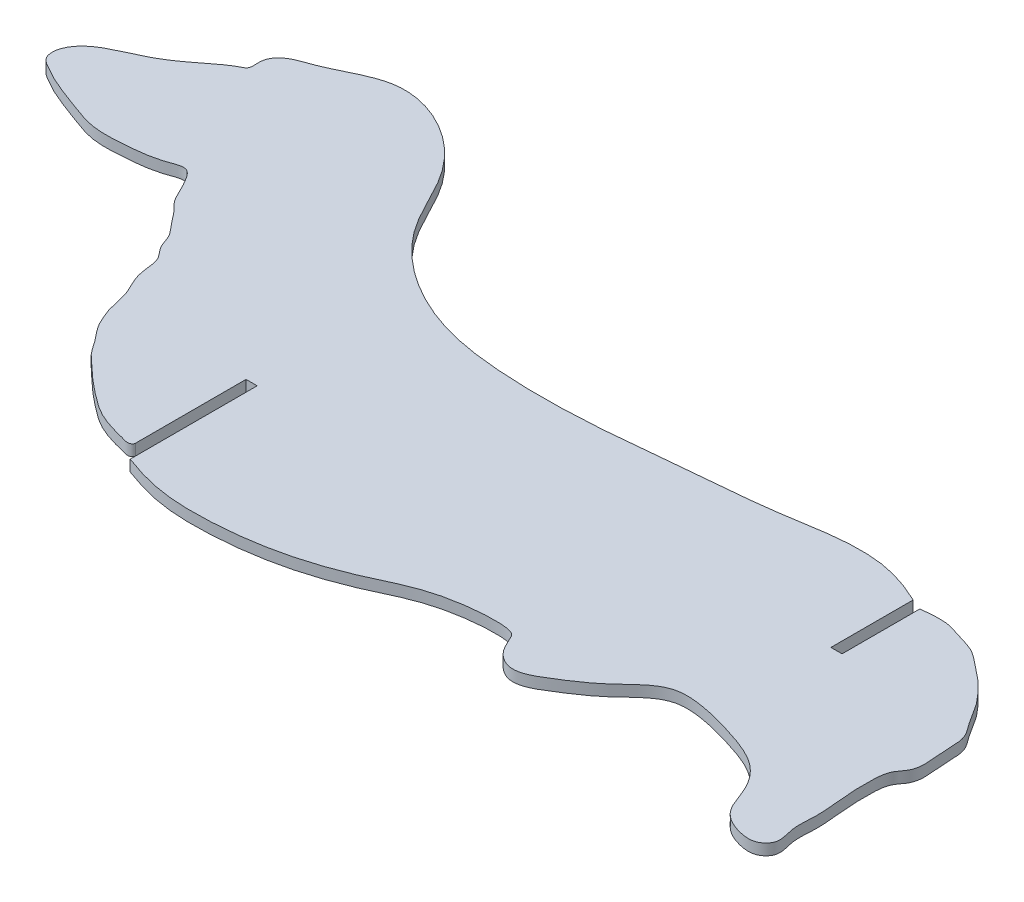
ISO-10303-21;
HEADER;
FILE_DESCRIPTION(('STEP AP214'),'2;1');
FILE_NAME('part.step','',(''),(''),'','','');
FILE_SCHEMA(('AUTOMOTIVE_DESIGN { 1 0 10303 214 1 1 1 1 }'));
ENDSEC;
DATA;
#1=APPLICATION_CONTEXT('core data for automotive mechanical design processes');
#2=APPLICATION_PROTOCOL_DEFINITION('international standard','automotive_design',2000,#1);
#3=PRODUCT_CONTEXT('',#1,'mechanical');
#4=PRODUCT('Part','Part','',(#3));
#5=PRODUCT_RELATED_PRODUCT_CATEGORY('part','',(#4));
#6=PRODUCT_DEFINITION_FORMATION('','',#4);
#7=PRODUCT_DEFINITION_CONTEXT('part definition',#1,'design');
#8=PRODUCT_DEFINITION('design','',#6,#7);
#9=PRODUCT_DEFINITION_SHAPE('','',#8);
#10=(LENGTH_UNIT() NAMED_UNIT(*) SI_UNIT(.MILLI.,.METRE.));
#11=(NAMED_UNIT(*) PLANE_ANGLE_UNIT() SI_UNIT($,.RADIAN.));
#12=(NAMED_UNIT(*) SI_UNIT($,.STERADIAN.) SOLID_ANGLE_UNIT());
#13=UNCERTAINTY_MEASURE_WITH_UNIT(LENGTH_MEASURE(1.E-05),#10,'distance_accuracy_value','');
#14=(GEOMETRIC_REPRESENTATION_CONTEXT(3) GLOBAL_UNCERTAINTY_ASSIGNED_CONTEXT((#13)) GLOBAL_UNIT_ASSIGNED_CONTEXT((#10,
#11,#12)) REPRESENTATION_CONTEXT('',''));
#15=CARTESIAN_POINT('',(0.,0.,0.));
#16=DIRECTION('',(0.,0.,1.));
#17=DIRECTION('',(1.,0.,0.));
#18=AXIS2_PLACEMENT_3D('',#15,#16,#17);
#19=CARTESIAN_POINT('',(347.154940736073,4.,-178.835013287636));
#20=CARTESIAN_POINT('',(342.293607839143,4.,-181.186392839244));
#21=CARTESIAN_POINT('',(331.73242464091,4.,-185.153225370964));
#22=CARTESIAN_POINT('',(314.956061353341,4.,-185.038996912233));
#23=CARTESIAN_POINT('',(301.512037992343,4.,-182.548513603452));
#24=CARTESIAN_POINT('',(288.369314790779,4.,-180.712531749732));
#25=CARTESIAN_POINT('',(275.639773261778,4.,-179.518770363029));
#26=CARTESIAN_POINT('',(261.9069176465,4.,-178.33166597074));
#27=CARTESIAN_POINT('',(236.902942328031,4.,-175.607244471271));
#28=CARTESIAN_POINT('',(210.119280857842,4.,-174.2129973985));
#29=CARTESIAN_POINT('',(171.594159560606,4.,-179.382417069147));
#30=CARTESIAN_POINT('',(143.24394217816,4.,-196.951507972517));
#31=CARTESIAN_POINT('',(132.124684399036,4.,-225.946741459528));
#32=CARTESIAN_POINT('',(116.595629551791,4.,-241.881053305595));
#33=CARTESIAN_POINT('',(93.2745023401633,4.,-249.601998196712));
#34=CARTESIAN_POINT('',(77.8881854564013,4.,-238.714659758299));
#35=CARTESIAN_POINT('',(65.9007764332672,4.,-235.410172879554));
#36=CARTESIAN_POINT('',(61.575621974339,4.,-230.200420009082));
#37=CARTESIAN_POINT('',(63.1087336538009,4.,-225.045424662309));
#38=CARTESIAN_POINT('',(58.2569010594505,4.,-222.644574465773));
#39=CARTESIAN_POINT('',(51.9612501600106,4.,-217.76519650174));
#40=CARTESIAN_POINT('',(40.1028496615363,4.,-208.402991105785));
#41=CARTESIAN_POINT('',(25.0000577471441,4.,-204.584232406003));
#42=CARTESIAN_POINT('',(21.9847867933513,4.,-195.272937398553));
#43=CARTESIAN_POINT('',(22.3434038090854,4.,-191.414002466728));
#44=CARTESIAN_POINT('',(26.5729575530105,4.,-188.934116633953));
#45=CARTESIAN_POINT('',(32.4195465597208,4.,-185.632752641192));
#46=CARTESIAN_POINT('',(41.394029651552,4.,-182.58042096067));
#47=CARTESIAN_POINT('',(52.2541674024652,4.,-177.924905927661));
#48=CARTESIAN_POINT('',(64.955899896082,4.,-178.924815079892));
#49=CARTESIAN_POINT('',(74.5177939393612,4.,-179.764064840546));
#50=CARTESIAN_POINT('',(82.7519774367339,4.,-183.513799817442));
#51=CARTESIAN_POINT('',(85.9496901633869,4.,-178.772495524308));
#52=CARTESIAN_POINT('',(88.1852768478482,4.,-174.730099673028));
#53=CARTESIAN_POINT('',(90.0906806723707,4.,-170.107982483323));
#54=CARTESIAN_POINT('',(94.2337058814481,4.,-166.565028145157));
#55=CARTESIAN_POINT('',(96.9706817129451,4.,-162.305172448172));
#56=CARTESIAN_POINT('',(100.834329657309,4.,-158.438030066546));
#57=CARTESIAN_POINT('',(101.758335513837,4.,-153.260977062174));
#58=CARTESIAN_POINT('',(106.234933482954,4.,-149.362890402545));
#59=CARTESIAN_POINT('',(106.221292919551,4.,-143.311246980581));
#60=CARTESIAN_POINT('',(107.917669571942,4.,-137.852932470716));
#61=CARTESIAN_POINT('',(111.115416691115,4.,-132.255595862831));
#62=CARTESIAN_POINT('',(111.717279817789,4.,-126.531053277943));
#63=CARTESIAN_POINT('',(113.762529451718,4.,-121.417745578651));
#64=CARTESIAN_POINT('',(115.78796773556,4.,-116.925498417731));
#65=CARTESIAN_POINT('',(119.696113679794,4.,-112.776543781616));
#66=CARTESIAN_POINT('',(122.55939647023,4.,-107.879756860782));
#67=CARTESIAN_POINT('',(126.811902979161,4.,-104.312348214879));
#68=CARTESIAN_POINT('',(131.204516654553,4.,-99.9841873882411));
#69=CARTESIAN_POINT('',(137.851723764725,4.,-94.760355766804));
#70=CARTESIAN_POINT('',(144.639485049006,4.,-89.6770931387765));
#71=CARTESIAN_POINT('',(154.332393864862,4.,-87.3302270861626));
#72=CARTESIAN_POINT('',(154.676156100739,4.,-87.2833505087554));
#73=CARTESIAN_POINT('',(158.493043825809,4.,-85.9402831956329));
#74=CARTESIAN_POINT('',(158.799844598838,4.,-87.8720571740243));
#75=CARTESIAN_POINT('',(158.758898458695,4.,-87.8711346052723));
#76=B_SPLINE_CURVE_WITH_KNOTS('',3,(#19,#20,#21,#22,#23,#24,#25,#26,#27,#28,#29,#30,#31,#32,#33,
#34,#35,#36,#37,#38,#39,#40,#41,#42,#43,#44,#45,#46,#47,#48,#49,#50,#51,#52,#53,#54,#55,#56,#57,
#58,#59,#60,#61,#62,#63,#64,#65,#66,#67,#68,#69,#70,#71,#72,#73,#74,#75),.UNSPECIFIED.,.F.,.F.,
(4,1,1,1,1,1,1,1,1,1,1,1,1,1,1,1,1,1,1,1,1,1,1,1,1,1,1,1,1,1,1,1,1,1,1,1,1,1,1,1,1,1,1,1,1,1,1,
1,1,1,1,1,1,1,4),(0.,0.0278709083375577,0.0570504920506225,0.0848805502092884,
0.0982822597147534,0.125273316528022,0.150633205488108,0.169161561101356,0.25471975074705,
0.287216713923006,0.369493076448606,0.408005119177393,0.444216093894111,0.481764451160458,
0.521976580411592,0.53442600736581,0.54522141725226,0.553498076345198,0.555204353328569,
0.571842805637894,0.594976771085898,0.634375329420594,0.637983125004558,0.644971727318556,
0.652095714653422,0.66152778019762,0.680136978877294,0.700472890115877,0.721552302912233,
0.74331714210923,0.753145997251442,0.760746767574497,0.768608090998904,0.778040156543103,
0.785618969900207,0.796196845838206,0.804076920738509,0.813061588487777,0.82197955399495,
0.832551783881873,0.842282958536683,0.851406113730894,0.865319094380145,0.871224097064775,
0.879723851152031,0.890432724487636,0.900259329538096,0.908606328415212,0.918705106313164,
0.932164237587582,0.951132917555511,0.966810126784208,0.969283816647089,0.975869816184325,1.),.UNSPECIFIED.);
#77=DIRECTION('',(0.,-1.,0.));
#78=VECTOR('',#77,1.);
#79=SURFACE_OF_LINEAR_EXTRUSION('',#76,#78);
#80=CARTESIAN_POINT('',(347.154940736073,0.,-178.835013287636));
#81=CARTESIAN_POINT('',(342.293607839143,0.,-181.186392839244));
#82=CARTESIAN_POINT('',(331.73242464091,0.,-185.153225370964));
#83=CARTESIAN_POINT('',(314.956061353341,0.,-185.038996912233));
#84=CARTESIAN_POINT('',(301.512037992343,0.,-182.548513603452));
#85=CARTESIAN_POINT('',(288.369314790779,0.,-180.712531749732));
#86=CARTESIAN_POINT('',(275.639773261778,0.,-179.518770363029));
#87=CARTESIAN_POINT('',(261.9069176465,0.,-178.33166597074));
#88=CARTESIAN_POINT('',(236.902942328031,0.,-175.607244471271));
#89=CARTESIAN_POINT('',(210.119280857842,0.,-174.2129973985));
#90=CARTESIAN_POINT('',(171.594159560606,0.,-179.382417069147));
#91=CARTESIAN_POINT('',(143.24394217816,0.,-196.951507972517));
#92=CARTESIAN_POINT('',(132.124684399036,0.,-225.946741459528));
#93=CARTESIAN_POINT('',(116.595629551791,0.,-241.881053305595));
#94=CARTESIAN_POINT('',(93.2745023401633,0.,-249.601998196712));
#95=CARTESIAN_POINT('',(77.8881854564013,0.,-238.714659758299));
#96=CARTESIAN_POINT('',(65.9007764332672,0.,-235.410172879554));
#97=CARTESIAN_POINT('',(61.575621974339,0.,-230.200420009082));
#98=CARTESIAN_POINT('',(63.1087336538009,0.,-225.045424662309));
#99=CARTESIAN_POINT('',(58.2569010594505,0.,-222.644574465773));
#100=CARTESIAN_POINT('',(51.9612501600106,0.,-217.76519650174));
#101=CARTESIAN_POINT('',(40.1028496615363,0.,-208.402991105785));
#102=CARTESIAN_POINT('',(25.0000577471441,0.,-204.584232406003));
#103=CARTESIAN_POINT('',(21.9847867933513,0.,-195.272937398553));
#104=CARTESIAN_POINT('',(22.3434038090854,0.,-191.414002466728));
#105=CARTESIAN_POINT('',(26.5729575530105,0.,-188.934116633953));
#106=CARTESIAN_POINT('',(32.4195465597208,0.,-185.632752641192));
#107=CARTESIAN_POINT('',(41.394029651552,0.,-182.58042096067));
#108=CARTESIAN_POINT('',(52.2541674024652,0.,-177.924905927661));
#109=CARTESIAN_POINT('',(64.955899896082,0.,-178.924815079892));
#110=CARTESIAN_POINT('',(74.5177939393612,0.,-179.764064840546));
#111=CARTESIAN_POINT('',(82.7519774367339,0.,-183.513799817442));
#112=CARTESIAN_POINT('',(85.9496901633869,0.,-178.772495524308));
#113=CARTESIAN_POINT('',(88.1852768478482,0.,-174.730099673028));
#114=CARTESIAN_POINT('',(90.0906806723707,0.,-170.107982483323));
#115=CARTESIAN_POINT('',(94.2337058814481,0.,-166.565028145157));
#116=CARTESIAN_POINT('',(96.9706817129451,0.,-162.305172448172));
#117=CARTESIAN_POINT('',(100.834329657309,0.,-158.438030066546));
#118=CARTESIAN_POINT('',(101.758335513837,0.,-153.260977062174));
#119=CARTESIAN_POINT('',(106.234933482954,0.,-149.362890402545));
#120=CARTESIAN_POINT('',(106.221292919551,0.,-143.311246980581));
#121=CARTESIAN_POINT('',(107.917669571942,0.,-137.852932470716));
#122=CARTESIAN_POINT('',(111.115416691115,0.,-132.255595862831));
#123=CARTESIAN_POINT('',(111.717279817789,0.,-126.531053277943));
#124=CARTESIAN_POINT('',(113.762529451718,0.,-121.417745578651));
#125=CARTESIAN_POINT('',(115.78796773556,0.,-116.925498417731));
#126=CARTESIAN_POINT('',(119.696113679794,0.,-112.776543781616));
#127=CARTESIAN_POINT('',(122.55939647023,0.,-107.879756860782));
#128=CARTESIAN_POINT('',(126.811902979161,0.,-104.312348214879));
#129=CARTESIAN_POINT('',(131.204516654553,0.,-99.9841873882411));
#130=CARTESIAN_POINT('',(137.851723764725,0.,-94.760355766804));
#131=CARTESIAN_POINT('',(144.639485049006,0.,-89.6770931387765));
#132=CARTESIAN_POINT('',(154.332393864862,0.,-87.3302270861626));
#133=CARTESIAN_POINT('',(154.676156100739,0.,-87.2833505087554));
#134=CARTESIAN_POINT('',(158.493043825809,0.,-85.9402831956329));
#135=CARTESIAN_POINT('',(158.799844598838,0.,-87.8720571740243));
#136=CARTESIAN_POINT('',(158.758898458695,0.,-87.8711346052723));
#137=B_SPLINE_CURVE_WITH_KNOTS('',3,(#80,#81,#82,#83,#84,#85,#86,#87,#88,#89,#90,#91,#92,#93,
#94,#95,#96,#97,#98,#99,#100,#101,#102,#103,#104,#105,#106,#107,#108,#109,#110,#111,#112,#113,
#114,#115,#116,#117,#118,#119,#120,#121,#122,#123,#124,#125,#126,#127,#128,#129,#130,#131,#132,
#133,#134,#135,#136),.UNSPECIFIED.,.F.,.F.,(4,1,1,1,1,1,1,1,1,1,1,1,1,1,1,1,1,1,1,1,1,1,1,1,1,1,
1,1,1,1,1,1,1,1,1,1,1,1,1,1,1,1,1,1,1,1,1,1,1,1,1,1,1,1,4),(0.,0.0278709083375577,
0.0570504920506225,0.0848805502092884,0.0982822597147534,0.125273316528022,0.150633205488108,
0.169161561101356,0.25471975074705,0.287216713923006,0.369493076448606,0.408005119177393,
0.444216093894111,0.481764451160458,0.521976580411592,0.53442600736581,0.54522141725226,
0.553498076345198,0.555204353328569,0.571842805637894,0.594976771085898,0.634375329420594,
0.637983125004558,0.644971727318556,0.652095714653422,0.66152778019762,0.680136978877294,
0.700472890115877,0.721552302912233,0.74331714210923,0.753145997251442,0.760746767574497,
0.768608090998904,0.778040156543103,0.785618969900207,0.796196845838206,0.804076920738509,
0.813061588487777,0.82197955399495,0.832551783881873,0.842282958536683,0.851406113730894,
0.865319094380145,0.871224097064775,0.879723851152031,0.890432724487636,0.900259329538096,
0.908606328415212,0.918705106313164,0.932164237587582,0.951132917555511,0.966810126784208,
0.969283816647089,0.975869816184325,1.),.UNSPECIFIED.);
#138=CARTESIAN_POINT('',(347.154940736073,0.,-178.835013287636));
#139=VERTEX_POINT('',#138);
#140=CARTESIAN_POINT('',(158.758898458695,0.,-87.8711346052723));
#141=VERTEX_POINT('',#140);
#142=EDGE_CURVE('E141',#139,#141,#137,.T.);
#143=ORIENTED_EDGE('',*,*,#142,.T.);
#144=DIRECTION('',(0.,-1.,0.));
#145=VECTOR('',#144,1.);
#146=CARTESIAN_POINT('',(158.758898458695,4.,-87.8711346052723));
#147=LINE('',#146,#145);
#148=CARTESIAN_POINT('',(158.758898458695,4.,-87.8711346052723));
#149=VERTEX_POINT('',#148);
#150=EDGE_CURVE('E11',#149,#141,#147,.T.);
#151=ORIENTED_EDGE('',*,*,#150,.F.);
#152=CARTESIAN_POINT('',(347.154940736073,4.,-178.835013287636));
#153=VERTEX_POINT('',#152);
#154=EDGE_CURVE('E173',#153,#149,#76,.T.);
#155=ORIENTED_EDGE('',*,*,#154,.F.);
#156=DIRECTION('',(0.,-1.,0.));
#157=VECTOR('',#156,1.);
#158=CARTESIAN_POINT('',(347.154940736073,4.,-178.835013287636));
#159=LINE('',#158,#157);
#160=EDGE_CURVE('E137',#153,#139,#159,.T.);
#161=ORIENTED_EDGE('',*,*,#160,.T.);
#162=EDGE_LOOP('',(#143,#151,#155,#161));
#163=FACE_BOUND('',#162,.T.);
#164=ADVANCED_FACE('F39',(#163),#79,.F.);
#165=CARTESIAN_POINT('',(158.758898458695,4.,-127.64552843434));
#166=DIRECTION('',(-1.,0.,0.));
#167=DIRECTION('',(0.,0.,1.));
#168=AXIS2_PLACEMENT_3D('',#165,#166,#167);
#169=PLANE('',#168);
#170=DIRECTION('',(0.,0.,-1.));
#171=VECTOR('',#170,1.);
#172=CARTESIAN_POINT('',(158.758898458695,0.,-127.64552843434));
#173=LINE('',#172,#171);
#174=CARTESIAN_POINT('',(158.758898458695,0.,-127.64552843434));
#175=VERTEX_POINT('',#174);
#176=EDGE_CURVE('E147',#141,#175,#173,.T.);
#177=ORIENTED_EDGE('',*,*,#176,.T.);
#178=DIRECTION('',(0.,-1.,0.));
#179=VECTOR('',#178,1.);
#180=CARTESIAN_POINT('',(158.758898458695,4.,-127.64552843434));
#181=LINE('',#180,#179);
#182=CARTESIAN_POINT('',(158.758898458695,4.,-127.64552843434));
#183=VERTEX_POINT('',#182);
#184=EDGE_CURVE('E49',#183,#175,#181,.T.);
#185=ORIENTED_EDGE('',*,*,#184,.F.);
#186=DIRECTION('',(0.,0.,-1.));
#187=VECTOR('',#186,1.);
#188=CARTESIAN_POINT('',(158.758898458695,4.,-127.64552843434));
#189=LINE('',#188,#187);
#190=EDGE_CURVE('E100',#149,#183,#189,.T.);
#191=ORIENTED_EDGE('',*,*,#190,.F.);
#192=ORIENTED_EDGE('',*,*,#150,.T.);
#193=EDGE_LOOP('',(#177,#185,#191,#192));
#194=FACE_BOUND('',#193,.T.);
#195=ADVANCED_FACE('F225',(#194),#169,.F.);
#196=CARTESIAN_POINT('',(158.758898458695,4.,-127.64552843434));
#197=DIRECTION('',(0.,0.,-1.));
#198=DIRECTION('',(-1.,0.,0.));
#199=AXIS2_PLACEMENT_3D('',#196,#197,#198);
#200=PLANE('',#199);
#201=DIRECTION('',(1.,0.,0.));
#202=VECTOR('',#201,1.);
#203=CARTESIAN_POINT('',(158.758898458695,0.,-127.64552843434));
#204=LINE('',#203,#202);
#205=CARTESIAN_POINT('',(162.758898458695,0.,-127.64552843434));
#206=VERTEX_POINT('',#205);
#207=EDGE_CURVE('E153',#175,#206,#204,.T.);
#208=ORIENTED_EDGE('',*,*,#207,.T.);
#209=DIRECTION('',(0.,-1.,0.));
#210=VECTOR('',#209,1.);
#211=CARTESIAN_POINT('',(162.758898458695,4.,-127.64552843434));
#212=LINE('',#211,#210);
#213=CARTESIAN_POINT('',(162.758898458695,4.,-127.64552843434));
#214=VERTEX_POINT('',#213);
#215=EDGE_CURVE('E184',#214,#206,#212,.T.);
#216=ORIENTED_EDGE('',*,*,#215,.F.);
#217=DIRECTION('',(1.,0.,0.));
#218=VECTOR('',#217,1.);
#219=CARTESIAN_POINT('',(158.758898458695,4.,-127.64552843434));
#220=LINE('',#219,#218);
#221=EDGE_CURVE('E194',#183,#214,#220,.T.);
#222=ORIENTED_EDGE('',*,*,#221,.F.);
#223=ORIENTED_EDGE('',*,*,#184,.T.);
#224=EDGE_LOOP('',(#208,#216,#222,#223));
#225=FACE_BOUND('',#224,.T.);
#226=ADVANCED_FACE('F192',(#225),#200,.F.);
#227=CARTESIAN_POINT('',(162.758898458695,4.,-127.64552843434));
#228=DIRECTION('',(1.,0.,0.));
#229=DIRECTION('',(0.,0.,-1.));
#230=AXIS2_PLACEMENT_3D('',#227,#228,#229);
#231=PLANE('',#230);
#232=DIRECTION('',(0.,0.,1.));
#233=VECTOR('',#232,1.);
#234=CARTESIAN_POINT('',(162.758898458695,0.,-127.64552843434));
#235=LINE('',#234,#233);
#236=CARTESIAN_POINT('',(162.758898458695,0.,-82.0276300327932));
#237=VERTEX_POINT('',#236);
#238=EDGE_CURVE('E156',#206,#237,#235,.T.);
#239=ORIENTED_EDGE('',*,*,#238,.T.);
#240=DIRECTION('',(0.,-1.,0.));
#241=VECTOR('',#240,1.);
#242=CARTESIAN_POINT('',(162.758898458695,4.,-82.0276300327932));
#243=LINE('',#242,#241);
#244=CARTESIAN_POINT('',(162.758898458695,4.,-82.0276300327932));
#245=VERTEX_POINT('',#244);
#246=EDGE_CURVE('E180',#245,#237,#243,.T.);
#247=ORIENTED_EDGE('',*,*,#246,.F.);
#248=DIRECTION('',(0.,0.,1.));
#249=VECTOR('',#248,1.);
#250=CARTESIAN_POINT('',(162.758898458695,4.,-127.64552843434));
#251=LINE('',#250,#249);
#252=EDGE_CURVE('E207',#214,#245,#251,.T.);
#253=ORIENTED_EDGE('',*,*,#252,.F.);
#254=ORIENTED_EDGE('',*,*,#215,.T.);
#255=EDGE_LOOP('',(#239,#247,#253,#254));
#256=FACE_BOUND('',#255,.T.);
#257=ADVANCED_FACE('F202',(#256),#231,.F.);
#258=CARTESIAN_POINT('',(162.758898458695,4.,-82.0276300327932));
#259=CARTESIAN_POINT('',(174.080106128941,4.,-77.7363912409929));
#260=CARTESIAN_POINT('',(187.326611616877,4.,-76.2210957878941));
#261=CARTESIAN_POINT('',(208.574132340161,4.,-77.6951301424278));
#262=CARTESIAN_POINT('',(225.78410235463,4.,-81.3569158487342));
#263=CARTESIAN_POINT('',(244.0508933822,4.,-88.2333885670921));
#264=CARTESIAN_POINT('',(258.840850979928,4.,-96.6233665223545));
#265=CARTESIAN_POINT('',(284.417834842925,4.,-98.3845036254783));
#266=CARTESIAN_POINT('',(287.140843266299,4.,-94.0714377764219));
#267=CARTESIAN_POINT('',(288.873971160061,4.,-88.9383959469942));
#268=CARTESIAN_POINT('',(296.810103799503,4.,-83.3275391861547));
#269=CARTESIAN_POINT('',(308.059611208014,4.,-90.2670305853191));
#270=CARTESIAN_POINT('',(319.355749972972,4.,-97.7078876567427));
#271=CARTESIAN_POINT('',(329.284864381607,4.,-109.385565447892));
#272=CARTESIAN_POINT('',(343.698502795428,4.,-108.030738101518));
#273=CARTESIAN_POINT('',(356.212606758835,4.,-104.464890414067));
#274=CARTESIAN_POINT('',(369.078058080701,4.,-99.8633466992855));
#275=CARTESIAN_POINT('',(376.510774585082,4.,-89.76312431448));
#276=CARTESIAN_POINT('',(378.865577033568,4.,-79.1404105630275));
#277=CARTESIAN_POINT('',(387.542897519948,4.,-75.2052524335292));
#278=CARTESIAN_POINT('',(394.304392522167,4.,-74.6798044468502));
#279=CARTESIAN_POINT('',(398.997386217693,4.,-79.1796947367012));
#280=CARTESIAN_POINT('',(396.082576083003,4.,-85.9810214629125));
#281=CARTESIAN_POINT('',(397.401742885695,4.,-95.0693896582527));
#282=CARTESIAN_POINT('',(395.872672974796,4.,-105.06328862782));
#283=CARTESIAN_POINT('',(395.642107925541,4.,-114.41045582355));
#284=CARTESIAN_POINT('',(396.112212051233,4.,-121.33437420719));
#285=CARTESIAN_POINT('',(399.267897263208,4.,-124.642599032899));
#286=CARTESIAN_POINT('',(400.514016983131,4.,-128.494387448499));
#287=CARTESIAN_POINT('',(400.174463101764,4.,-132.172542362959));
#288=CARTESIAN_POINT('',(399.834010289167,4.,-136.411832061896));
#289=CARTESIAN_POINT('',(399.714343934774,4.,-140.756709085506));
#290=CARTESIAN_POINT('',(399.27880410684,4.,-145.681210165648));
#291=CARTESIAN_POINT('',(395.103537132139,4.,-150.824508365598));
#292=CARTESIAN_POINT('',(392.11837853511,4.,-156.654643058381));
#293=CARTESIAN_POINT('',(387.05841615922,4.,-162.344018108135));
#294=CARTESIAN_POINT('',(382.721951942159,4.,-166.557677857205));
#295=CARTESIAN_POINT('',(377.764807482115,4.,-170.206950938191));
#296=CARTESIAN_POINT('',(373.121683236264,4.,-174.20523347069));
#297=CARTESIAN_POINT('',(363.956761151681,4.,-176.263574309791));
#298=CARTESIAN_POINT('',(360.888821506695,4.,-178.490697636685));
#299=CARTESIAN_POINT('',(351.154940736073,4.,-177.212936174208));
#300=B_SPLINE_CURVE_WITH_KNOTS('',3,(#258,#259,#260,#261,#262,#263,#264,#265,#266,#267,#268,
#269,#270,#271,#272,#273,#274,#275,#276,#277,#278,#279,#280,#281,#282,#283,#284,#285,#286,#287,
#288,#289,#290,#291,#292,#293,#294,#295,#296,#297,#298,#299),.UNSPECIFIED.,.F.,.F.,(4,1,1,1,1,1,
1,1,1,1,1,1,1,1,1,1,1,1,1,1,1,1,1,1,1,1,1,1,1,1,1,1,1,1,1,1,1,1,1,4),(0.,0.0357695957122319,
0.0627198055450586,0.08896625175081,0.112042963444275,0.14349039237858,0.174363348334606,
0.179831805486879,0.198174963901316,0.221107830898964,0.26043557071982,0.304523347262856,
0.355897989738319,0.389330046126145,0.431438100185175,0.48092103603087,0.51139325052569,
0.545692038684389,0.576182309005605,0.59306831499602,0.606430663853604,0.628498820892278,
0.653091877863338,0.69300241644941,0.721356272310565,0.742255957676464,0.754376249752801,
0.76272316406521,0.779364136123448,0.788394639274289,0.802583610470182,0.82045255009226,
0.832717095006374,0.863421332177634,0.881695205334798,0.903654668141811,0.919957568530991,
0.939264845617325,0.96099243846365,1.),.UNSPECIFIED.);
#301=DIRECTION('',(0.,-1.,0.));
#302=VECTOR('',#301,1.);
#303=SURFACE_OF_LINEAR_EXTRUSION('',#300,#302);
#304=CARTESIAN_POINT('',(162.758898458695,0.,-82.0276300327932));
#305=CARTESIAN_POINT('',(174.080106128941,0.,-77.7363912409929));
#306=CARTESIAN_POINT('',(187.326611616877,0.,-76.2210957878941));
#307=CARTESIAN_POINT('',(208.574132340161,0.,-77.6951301424278));
#308=CARTESIAN_POINT('',(225.78410235463,0.,-81.3569158487342));
#309=CARTESIAN_POINT('',(244.0508933822,0.,-88.2333885670921));
#310=CARTESIAN_POINT('',(258.840850979928,0.,-96.6233665223545));
#311=CARTESIAN_POINT('',(284.417834842925,0.,-98.3845036254783));
#312=CARTESIAN_POINT('',(287.140843266299,0.,-94.0714377764219));
#313=CARTESIAN_POINT('',(288.873971160061,0.,-88.9383959469942));
#314=CARTESIAN_POINT('',(296.810103799503,0.,-83.3275391861547));
#315=CARTESIAN_POINT('',(308.059611208014,0.,-90.2670305853191));
#316=CARTESIAN_POINT('',(319.355749972972,0.,-97.7078876567427));
#317=CARTESIAN_POINT('',(329.284864381607,0.,-109.385565447892));
#318=CARTESIAN_POINT('',(343.698502795428,0.,-108.030738101518));
#319=CARTESIAN_POINT('',(356.212606758835,0.,-104.464890414067));
#320=CARTESIAN_POINT('',(369.078058080701,0.,-99.8633466992855));
#321=CARTESIAN_POINT('',(376.510774585082,0.,-89.76312431448));
#322=CARTESIAN_POINT('',(378.865577033568,0.,-79.1404105630275));
#323=CARTESIAN_POINT('',(387.542897519948,0.,-75.2052524335292));
#324=CARTESIAN_POINT('',(394.304392522167,0.,-74.6798044468502));
#325=CARTESIAN_POINT('',(398.997386217693,0.,-79.1796947367012));
#326=CARTESIAN_POINT('',(396.082576083003,0.,-85.9810214629125));
#327=CARTESIAN_POINT('',(397.401742885695,0.,-95.0693896582527));
#328=CARTESIAN_POINT('',(395.872672974796,0.,-105.06328862782));
#329=CARTESIAN_POINT('',(395.642107925541,0.,-114.41045582355));
#330=CARTESIAN_POINT('',(396.112212051233,0.,-121.33437420719));
#331=CARTESIAN_POINT('',(399.267897263208,0.,-124.642599032899));
#332=CARTESIAN_POINT('',(400.514016983131,0.,-128.494387448499));
#333=CARTESIAN_POINT('',(400.174463101764,0.,-132.172542362959));
#334=CARTESIAN_POINT('',(399.834010289167,0.,-136.411832061896));
#335=CARTESIAN_POINT('',(399.714343934774,0.,-140.756709085506));
#336=CARTESIAN_POINT('',(399.27880410684,0.,-145.681210165648));
#337=CARTESIAN_POINT('',(395.103537132139,0.,-150.824508365598));
#338=CARTESIAN_POINT('',(392.11837853511,0.,-156.654643058381));
#339=CARTESIAN_POINT('',(387.05841615922,0.,-162.344018108135));
#340=CARTESIAN_POINT('',(382.721951942159,0.,-166.557677857205));
#341=CARTESIAN_POINT('',(377.764807482115,0.,-170.206950938191));
#342=CARTESIAN_POINT('',(373.121683236264,0.,-174.20523347069));
#343=CARTESIAN_POINT('',(363.956761151681,0.,-176.263574309791));
#344=CARTESIAN_POINT('',(360.888821506695,0.,-178.490697636685));
#345=CARTESIAN_POINT('',(351.154940736073,0.,-177.212936174208));
#346=B_SPLINE_CURVE_WITH_KNOTS('',3,(#304,#305,#306,#307,#308,#309,#310,#311,#312,#313,#314,
#315,#316,#317,#318,#319,#320,#321,#322,#323,#324,#325,#326,#327,#328,#329,#330,#331,#332,#333,
#334,#335,#336,#337,#338,#339,#340,#341,#342,#343,#344,#345),.UNSPECIFIED.,.F.,.F.,(4,1,1,1,1,1,
1,1,1,1,1,1,1,1,1,1,1,1,1,1,1,1,1,1,1,1,1,1,1,1,1,1,1,1,1,1,1,1,1,4),(0.,0.0357695957122319,
0.0627198055450586,0.08896625175081,0.112042963444275,0.14349039237858,0.174363348334606,
0.179831805486879,0.198174963901316,0.221107830898964,0.26043557071982,0.304523347262856,
0.355897989738319,0.389330046126145,0.431438100185175,0.48092103603087,0.51139325052569,
0.545692038684389,0.576182309005605,0.59306831499602,0.606430663853604,0.628498820892278,
0.653091877863338,0.69300241644941,0.721356272310565,0.742255957676464,0.754376249752801,
0.76272316406521,0.779364136123448,0.788394639274289,0.802583610470182,0.82045255009226,
0.832717095006374,0.863421332177634,0.881695205334798,0.903654668141811,0.919957568530991,
0.939264845617325,0.96099243846365,1.),.UNSPECIFIED.);
#347=CARTESIAN_POINT('',(351.154940736073,0.,-177.212936174208));
#348=VERTEX_POINT('',#347);
#349=EDGE_CURVE('E159',#237,#348,#346,.T.);
#350=ORIENTED_EDGE('',*,*,#349,.T.);
#351=DIRECTION('',(0.,-1.,0.));
#352=VECTOR('',#351,1.);
#353=CARTESIAN_POINT('',(351.154940736073,4.,-177.212936174208));
#354=LINE('',#353,#352);
#355=CARTESIAN_POINT('',(351.154940736073,4.,-177.212936174208));
#356=VERTEX_POINT('',#355);
#357=EDGE_CURVE('E130',#356,#348,#354,.T.);
#358=ORIENTED_EDGE('',*,*,#357,.F.);
#359=EDGE_CURVE('E119',#245,#356,#300,.T.);
#360=ORIENTED_EDGE('',*,*,#359,.F.);
#361=ORIENTED_EDGE('',*,*,#246,.T.);
#362=EDGE_LOOP('',(#350,#358,#360,#361));
#363=FACE_BOUND('',#362,.T.);
#364=ADVANCED_FACE('F205',(#363),#303,.F.);
#365=CARTESIAN_POINT('',(351.154940736073,4.,-149.302896471935));
#366=DIRECTION('',(1.,0.,0.));
#367=DIRECTION('',(0.,0.,-1.));
#368=AXIS2_PLACEMENT_3D('',#365,#366,#367);
#369=PLANE('',#368);
#370=DIRECTION('',(0.,0.,1.));
#371=VECTOR('',#370,1.);
#372=CARTESIAN_POINT('',(351.154940736073,0.,-149.302896471935));
#373=LINE('',#372,#371);
#374=CARTESIAN_POINT('',(351.154940736073,0.,-149.302896471935));
#375=VERTEX_POINT('',#374);
#376=EDGE_CURVE('E128',#348,#375,#373,.T.);
#377=ORIENTED_EDGE('',*,*,#376,.T.);
#378=DIRECTION('',(0.,-1.,0.));
#379=VECTOR('',#378,1.);
#380=CARTESIAN_POINT('',(351.154940736073,4.,-149.302896471935));
#381=LINE('',#380,#379);
#382=CARTESIAN_POINT('',(351.154940736073,4.,-149.302896471935));
#383=VERTEX_POINT('',#382);
#384=EDGE_CURVE('E125',#383,#375,#381,.T.);
#385=ORIENTED_EDGE('',*,*,#384,.F.);
#386=DIRECTION('',(0.,0.,1.));
#387=VECTOR('',#386,1.);
#388=CARTESIAN_POINT('',(351.154940736073,4.,-149.302896471935));
#389=LINE('',#388,#387);
#390=EDGE_CURVE('E113',#356,#383,#389,.T.);
#391=ORIENTED_EDGE('',*,*,#390,.F.);
#392=ORIENTED_EDGE('',*,*,#357,.T.);
#393=EDGE_LOOP('',(#377,#385,#391,#392));
#394=FACE_BOUND('',#393,.T.);
#395=ADVANCED_FACE('F126',(#394),#369,.F.);
#396=CARTESIAN_POINT('',(347.154940736073,4.,-149.302896471935));
#397=DIRECTION('',(0.,0.,1.));
#398=DIRECTION('',(1.,0.,0.));
#399=AXIS2_PLACEMENT_3D('',#396,#397,#398);
#400=PLANE('',#399);
#401=DIRECTION('',(-1.,0.,0.));
#402=VECTOR('',#401,1.);
#403=CARTESIAN_POINT('',(347.154940736073,0.,-149.302896471935));
#404=LINE('',#403,#402);
#405=CARTESIAN_POINT('',(347.154940736073,0.,-149.302896471935));
#406=VERTEX_POINT('',#405);
#407=EDGE_CURVE('E86',#375,#406,#404,.T.);
#408=ORIENTED_EDGE('',*,*,#407,.T.);
#409=DIRECTION('',(0.,-1.,0.));
#410=VECTOR('',#409,1.);
#411=CARTESIAN_POINT('',(347.154940736073,4.,-149.302896471935));
#412=LINE('',#411,#410);
#413=CARTESIAN_POINT('',(347.154940736073,4.,-149.302896471935));
#414=VERTEX_POINT('',#413);
#415=EDGE_CURVE('E131',#414,#406,#412,.T.);
#416=ORIENTED_EDGE('',*,*,#415,.F.);
#417=DIRECTION('',(-1.,0.,0.));
#418=VECTOR('',#417,1.);
#419=CARTESIAN_POINT('',(347.154940736073,4.,-149.302896471935));
#420=LINE('',#419,#418);
#421=EDGE_CURVE('E117',#383,#414,#420,.T.);
#422=ORIENTED_EDGE('',*,*,#421,.F.);
#423=ORIENTED_EDGE('',*,*,#384,.T.);
#424=EDGE_LOOP('',(#408,#416,#422,#423));
#425=FACE_BOUND('',#424,.T.);
#426=ADVANCED_FACE('F133',(#425),#400,.F.);
#427=CARTESIAN_POINT('',(347.154940736073,4.,-178.835013287636));
#428=DIRECTION('',(-1.,0.,0.));
#429=DIRECTION('',(0.,0.,1.));
#430=AXIS2_PLACEMENT_3D('',#427,#428,#429);
#431=PLANE('',#430);
#432=DIRECTION('',(0.,0.,-1.));
#433=VECTOR('',#432,1.);
#434=CARTESIAN_POINT('',(347.154940736073,0.,-178.835013287636));
#435=LINE('',#434,#433);
#436=EDGE_CURVE('E92',#406,#139,#435,.T.);
#437=ORIENTED_EDGE('',*,*,#436,.T.);
#438=ORIENTED_EDGE('',*,*,#160,.F.);
#439=DIRECTION('',(0.,0.,-1.));
#440=VECTOR('',#439,1.);
#441=CARTESIAN_POINT('',(347.154940736073,4.,-178.835013287636));
#442=LINE('',#441,#440);
#443=EDGE_CURVE('E57',#414,#153,#442,.T.);
#444=ORIENTED_EDGE('',*,*,#443,.F.);
#445=ORIENTED_EDGE('',*,*,#415,.T.);
#446=EDGE_LOOP('',(#437,#438,#444,#445));
#447=FACE_BOUND('',#446,.T.);
#448=ADVANCED_FACE('F233',(#447),#431,.F.);
#449=CARTESIAN_POINT('',(84.4610902057214,4.,-242.877859995681));
#450=DIRECTION('',(0.,-1.,0.));
#451=DIRECTION('',(0.,0.,-1.));
#452=AXIS2_PLACEMENT_3D('',#449,#450,#451);
#453=PLANE('',#452);
#454=ORIENTED_EDGE('',*,*,#154,.T.);
#455=ORIENTED_EDGE('',*,*,#190,.T.);
#456=ORIENTED_EDGE('',*,*,#221,.T.);
#457=ORIENTED_EDGE('',*,*,#252,.T.);
#458=ORIENTED_EDGE('',*,*,#359,.T.);
#459=ORIENTED_EDGE('',*,*,#390,.T.);
#460=ORIENTED_EDGE('',*,*,#421,.T.);
#461=ORIENTED_EDGE('',*,*,#443,.T.);
#462=EDGE_LOOP('',(#454,#455,#456,#457,#458,#459,#460,#461));
#463=FACE_BOUND('',#462,.T.);
#464=ADVANCED_FACE('F115',(#463),#453,.F.);
#465=CARTESIAN_POINT('',(84.4610902057214,0.,-242.877859995681));
#466=DIRECTION('',(0.,-1.,0.));
#467=DIRECTION('',(0.,0.,-1.));
#468=AXIS2_PLACEMENT_3D('',#465,#466,#467);
#469=PLANE('',#468);
#470=ORIENTED_EDGE('',*,*,#142,.F.);
#471=ORIENTED_EDGE('',*,*,#436,.F.);
#472=ORIENTED_EDGE('',*,*,#407,.F.);
#473=ORIENTED_EDGE('',*,*,#376,.F.);
#474=ORIENTED_EDGE('',*,*,#349,.F.);
#475=ORIENTED_EDGE('',*,*,#238,.F.);
#476=ORIENTED_EDGE('',*,*,#207,.F.);
#477=ORIENTED_EDGE('',*,*,#176,.F.);
#478=EDGE_LOOP('',(#470,#471,#472,#473,#474,#475,#476,#477));
#479=FACE_BOUND('',#478,.T.);
#480=ADVANCED_FACE('F198',(#479),#469,.T.);
#481=CLOSED_SHELL('',(#164,#195,#226,#257,#364,#395,#426,#448,#464,#480));
#482=MANIFOLD_SOLID_BREP('B2',#481);
#483=ADVANCED_BREP_SHAPE_REPRESENTATION('',(#18,#482),#14);
#484=SHAPE_DEFINITION_REPRESENTATION(#9,#483);
ENDSEC;
END-ISO-10303-21;
